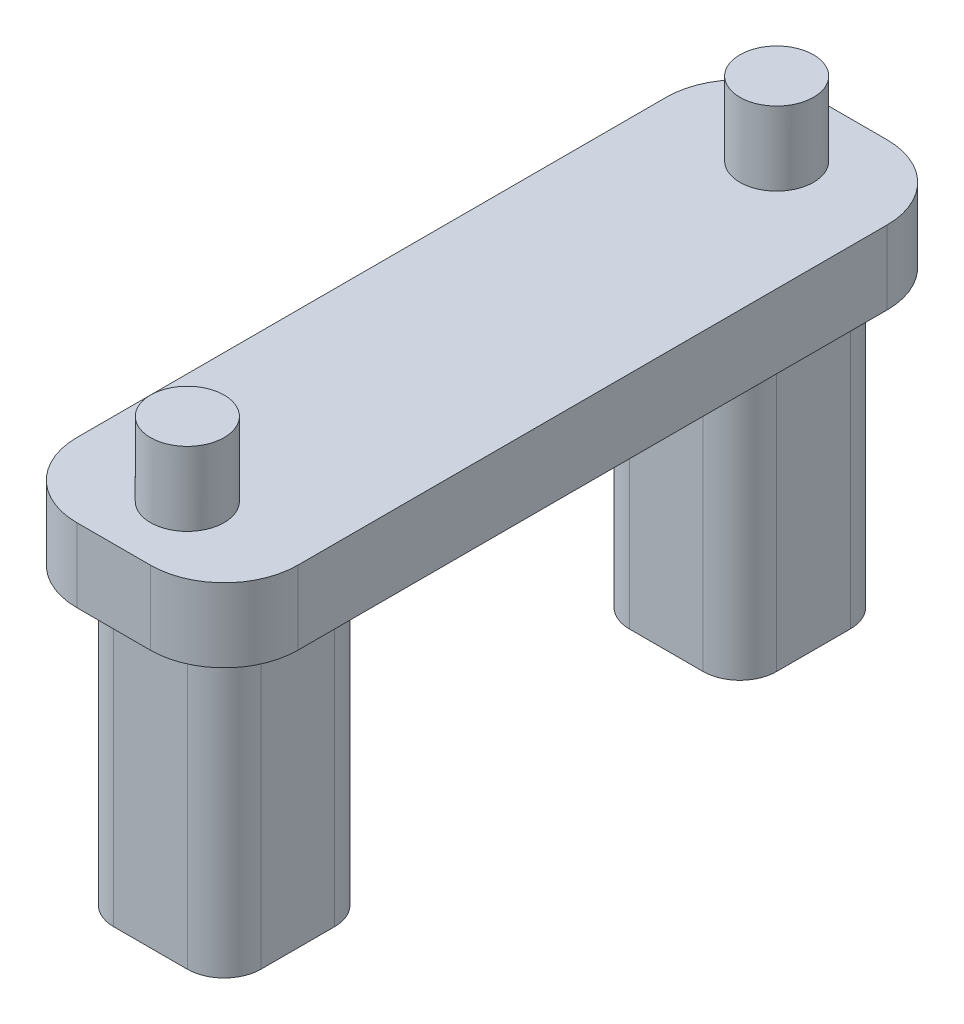
ISO-10303-21;
HEADER;
FILE_DESCRIPTION(('STEP AP214'),'2;1');
FILE_NAME('part.step','',(''),(''),'','','');
FILE_SCHEMA(('AUTOMOTIVE_DESIGN { 1 0 10303 214 1 1 1 1 }'));
ENDSEC;
DATA;
#1=APPLICATION_CONTEXT('core data for automotive mechanical design processes');
#2=APPLICATION_PROTOCOL_DEFINITION('international standard','automotive_design',2000,#1);
#3=PRODUCT_CONTEXT('',#1,'mechanical');
#4=PRODUCT('Part','Part','',(#3));
#5=PRODUCT_RELATED_PRODUCT_CATEGORY('part','',(#4));
#6=PRODUCT_DEFINITION_FORMATION('','',#4);
#7=PRODUCT_DEFINITION_CONTEXT('part definition',#1,'design');
#8=PRODUCT_DEFINITION('design','',#6,#7);
#9=PRODUCT_DEFINITION_SHAPE('','',#8);
#10=(LENGTH_UNIT() NAMED_UNIT(*) SI_UNIT(.MILLI.,.METRE.));
#11=(NAMED_UNIT(*) PLANE_ANGLE_UNIT() SI_UNIT($,.RADIAN.));
#12=(NAMED_UNIT(*) SI_UNIT($,.STERADIAN.) SOLID_ANGLE_UNIT());
#13=UNCERTAINTY_MEASURE_WITH_UNIT(LENGTH_MEASURE(1.E-05),#10,'distance_accuracy_value','');
#14=(GEOMETRIC_REPRESENTATION_CONTEXT(3) GLOBAL_UNCERTAINTY_ASSIGNED_CONTEXT((#13)) GLOBAL_UNIT_ASSIGNED_CONTEXT((#10,
#11,#12)) REPRESENTATION_CONTEXT('',''));
#15=CARTESIAN_POINT('',(0.,0.,0.));
#16=DIRECTION('',(0.,0.,1.));
#17=DIRECTION('',(1.,0.,0.));
#18=AXIS2_PLACEMENT_3D('',#15,#16,#17);
#19=CARTESIAN_POINT('',(0.,0.,0.));
#20=DIRECTION('',(0.,-1.,0.));
#21=DIRECTION('',(0.,0.,-1.));
#22=AXIS2_PLACEMENT_3D('',#19,#20,#21);
#23=PLANE('',#22);
#24=DIRECTION('',(0.,0.,1.));
#25=VECTOR('',#24,1.);
#26=CARTESIAN_POINT('',(-15.,0.,50.));
#27=LINE('',#26,#25);
#28=CARTESIAN_POINT('',(-15.,0.,-40.));
#29=VERTEX_POINT('',#28);
#30=CARTESIAN_POINT('',(-15.,0.,40.));
#31=VERTEX_POINT('',#30);
#32=EDGE_CURVE('E311',#29,#31,#27,.T.);
#33=ORIENTED_EDGE('',*,*,#32,.F.);
#34=CARTESIAN_POINT('',(-5.,0.,-40.));
#35=DIRECTION('',(0.,-1.,0.));
#36=DIRECTION('',(0.,0.,-1.));
#37=AXIS2_PLACEMENT_3D('',#34,#35,#36);
#38=CIRCLE('',#37,10.);
#39=CARTESIAN_POINT('',(-5.,0.,-50.));
#40=VERTEX_POINT('',#39);
#41=EDGE_CURVE('E332',#29,#40,#38,.T.);
#42=ORIENTED_EDGE('',*,*,#41,.T.);
#43=DIRECTION('',(-1.,0.,0.));
#44=VECTOR('',#43,1.);
#45=CARTESIAN_POINT('',(-15.,0.,-50.));
#46=LINE('',#45,#44);
#47=CARTESIAN_POINT('',(5.,0.,-50.));
#48=VERTEX_POINT('',#47);
#49=EDGE_CURVE('E308',#48,#40,#46,.T.);
#50=ORIENTED_EDGE('',*,*,#49,.F.);
#51=CARTESIAN_POINT('',(5.,0.,-40.));
#52=DIRECTION('',(0.,-1.,0.));
#53=DIRECTION('',(0.,0.,-1.));
#54=AXIS2_PLACEMENT_3D('',#51,#52,#53);
#55=CIRCLE('',#54,10.);
#56=CARTESIAN_POINT('',(15.,0.,-40.));
#57=VERTEX_POINT('',#56);
#58=EDGE_CURVE('E330',#48,#57,#55,.T.);
#59=ORIENTED_EDGE('',*,*,#58,.T.);
#60=DIRECTION('',(0.,0.,-1.));
#61=VECTOR('',#60,1.);
#62=CARTESIAN_POINT('',(15.,0.,50.));
#63=LINE('',#62,#61);
#64=CARTESIAN_POINT('',(15.,0.,40.));
#65=VERTEX_POINT('',#64);
#66=EDGE_CURVE('E291',#65,#57,#63,.T.);
#67=ORIENTED_EDGE('',*,*,#66,.F.);
#68=CARTESIAN_POINT('',(5.,0.,40.));
#69=DIRECTION('',(0.,-1.,0.));
#70=DIRECTION('',(0.,0.,-1.));
#71=AXIS2_PLACEMENT_3D('',#68,#69,#70);
#72=CIRCLE('',#71,10.);
#73=CARTESIAN_POINT('',(5.,0.,50.));
#74=VERTEX_POINT('',#73);
#75=EDGE_CURVE('E326',#65,#74,#72,.T.);
#76=ORIENTED_EDGE('',*,*,#75,.T.);
#77=DIRECTION('',(1.,0.,0.));
#78=VECTOR('',#77,1.);
#79=CARTESIAN_POINT('',(-15.,0.,50.));
#80=LINE('',#79,#78);
#81=CARTESIAN_POINT('',(-5.,0.,50.));
#82=VERTEX_POINT('',#81);
#83=EDGE_CURVE('E296',#82,#74,#80,.T.);
#84=ORIENTED_EDGE('',*,*,#83,.F.);
#85=CARTESIAN_POINT('',(-5.,0.,40.));
#86=DIRECTION('',(0.,-1.,0.));
#87=DIRECTION('',(0.,0.,-1.));
#88=AXIS2_PLACEMENT_3D('',#85,#86,#87);
#89=CIRCLE('',#88,10.);
#90=EDGE_CURVE('E328',#82,#31,#89,.T.);
#91=ORIENTED_EDGE('',*,*,#90,.T.);
#92=EDGE_LOOP('',(#33,#42,#50,#59,#67,#76,#84,#91));
#93=FACE_BOUND('',#92,.T.);
#94=DIRECTION('',(0.,0.,-1.));
#95=VECTOR('',#94,1.);
#96=CARTESIAN_POINT('',(-10.,0.,30.0000000000001));
#97=LINE('',#96,#95);
#98=CARTESIAN_POINT('',(-10.,0.,40.));
#99=VERTEX_POINT('',#98);
#100=CARTESIAN_POINT('',(-10.,0.,30.0000000000001));
#101=VERTEX_POINT('',#100);
#102=EDGE_CURVE('E228',#99,#101,#97,.T.);
#103=ORIENTED_EDGE('',*,*,#102,.F.);
#104=CARTESIAN_POINT('',(-5.,0.,40.));
#105=DIRECTION('',(0.,-1.,0.));
#106=DIRECTION('',(0.,0.,-1.));
#107=AXIS2_PLACEMENT_3D('',#104,#105,#106);
#108=CIRCLE('',#107,5.);
#109=CARTESIAN_POINT('',(-5.,0.,45.));
#110=VERTEX_POINT('',#109);
#111=EDGE_CURVE('E225',#110,#99,#108,.T.);
#112=ORIENTED_EDGE('',*,*,#111,.F.);
#113=DIRECTION('',(-1.,0.,0.));
#114=VECTOR('',#113,1.);
#115=CARTESIAN_POINT('',(-5.,0.,45.));
#116=LINE('',#115,#114);
#117=CARTESIAN_POINT('',(5.,0.,45.));
#118=VERTEX_POINT('',#117);
#119=EDGE_CURVE('E238',#118,#110,#116,.T.);
#120=ORIENTED_EDGE('',*,*,#119,.F.);
#121=CARTESIAN_POINT('',(5.,0.,40.));
#122=DIRECTION('',(0.,-1.,0.));
#123=DIRECTION('',(0.,0.,-1.));
#124=AXIS2_PLACEMENT_3D('',#121,#122,#123);
#125=CIRCLE('',#124,5.);
#126=CARTESIAN_POINT('',(10.,0.,40.));
#127=VERTEX_POINT('',#126);
#128=EDGE_CURVE('E262',#127,#118,#125,.T.);
#129=ORIENTED_EDGE('',*,*,#128,.F.);
#130=DIRECTION('',(0.,0.,1.));
#131=VECTOR('',#130,1.);
#132=CARTESIAN_POINT('',(10.,0.,40.));
#133=LINE('',#132,#131);
#134=CARTESIAN_POINT('',(10.,0.,30.));
#135=VERTEX_POINT('',#134);
#136=EDGE_CURVE('E260',#135,#127,#133,.T.);
#137=ORIENTED_EDGE('',*,*,#136,.F.);
#138=CARTESIAN_POINT('',(5.,0.,30.));
#139=DIRECTION('',(0.,-1.,0.));
#140=DIRECTION('',(0.,0.,1.));
#141=AXIS2_PLACEMENT_3D('',#138,#139,#140);
#142=CIRCLE('',#141,5.);
#143=CARTESIAN_POINT('',(4.99999999999993,0.,25.));
#144=VERTEX_POINT('',#143);
#145=EDGE_CURVE('E258',#144,#135,#142,.T.);
#146=ORIENTED_EDGE('',*,*,#145,.F.);
#147=DIRECTION('',(1.,0.,0.));
#148=VECTOR('',#147,1.);
#149=CARTESIAN_POINT('',(-4.99999999999996,0.,25.));
#150=LINE('',#149,#148);
#151=CARTESIAN_POINT('',(-4.99999999999996,0.,25.));
#152=VERTEX_POINT('',#151);
#153=EDGE_CURVE('E256',#152,#144,#150,.T.);
#154=ORIENTED_EDGE('',*,*,#153,.F.);
#155=CARTESIAN_POINT('',(-5.,0.,30.));
#156=DIRECTION('',(0.,-1.,0.));
#157=DIRECTION('',(0.,0.,-1.));
#158=AXIS2_PLACEMENT_3D('',#155,#156,#157);
#159=CIRCLE('',#158,5.);
#160=EDGE_CURVE('E254',#101,#152,#159,.T.);
#161=ORIENTED_EDGE('',*,*,#160,.F.);
#162=EDGE_LOOP('',(#103,#112,#120,#129,#137,#146,#154,#161));
#163=FACE_BOUND('',#162,.T.);
#164=DIRECTION('',(0.,0.,1.));
#165=VECTOR('',#164,1.);
#166=CARTESIAN_POINT('',(10.,0.,-30.0000000000001));
#167=LINE('',#166,#165);
#168=CARTESIAN_POINT('',(10.,0.,-40.));
#169=VERTEX_POINT('',#168);
#170=CARTESIAN_POINT('',(10.,0.,-30.0000000000001));
#171=VERTEX_POINT('',#170);
#172=EDGE_CURVE('E694',#169,#171,#167,.T.);
#173=ORIENTED_EDGE('',*,*,#172,.F.);
#174=CARTESIAN_POINT('',(5.,0.,-40.));
#175=DIRECTION('',(0.,-1.,0.));
#176=DIRECTION('',(0.,0.,-1.));
#177=AXIS2_PLACEMENT_3D('',#174,#175,#176);
#178=CIRCLE('',#177,5.);
#179=CARTESIAN_POINT('',(5.,0.,-45.));
#180=VERTEX_POINT('',#179);
#181=EDGE_CURVE('E223',#180,#169,#178,.T.);
#182=ORIENTED_EDGE('',*,*,#181,.F.);
#183=DIRECTION('',(1.,0.,0.));
#184=VECTOR('',#183,1.);
#185=CARTESIAN_POINT('',(5.,0.,-45.));
#186=LINE('',#185,#184);
#187=CARTESIAN_POINT('',(-5.,0.,-45.));
#188=VERTEX_POINT('',#187);
#189=EDGE_CURVE('E219',#188,#180,#186,.T.);
#190=ORIENTED_EDGE('',*,*,#189,.F.);
#191=CARTESIAN_POINT('',(-5.,0.,-40.));
#192=DIRECTION('',(0.,-1.,0.));
#193=DIRECTION('',(0.,0.,-1.));
#194=AXIS2_PLACEMENT_3D('',#191,#192,#193);
#195=CIRCLE('',#194,5.00000000000001);
#196=CARTESIAN_POINT('',(-10.,0.,-40.));
#197=VERTEX_POINT('',#196);
#198=EDGE_CURVE('E690',#197,#188,#195,.T.);
#199=ORIENTED_EDGE('',*,*,#198,.F.);
#200=DIRECTION('',(0.,0.,-1.));
#201=VECTOR('',#200,1.);
#202=CARTESIAN_POINT('',(-10.,0.,-40.));
#203=LINE('',#202,#201);
#204=CARTESIAN_POINT('',(-10.,0.,-30.0000000000001));
#205=VERTEX_POINT('',#204);
#206=EDGE_CURVE('E706',#205,#197,#203,.T.);
#207=ORIENTED_EDGE('',*,*,#206,.F.);
#208=CARTESIAN_POINT('',(-5.,0.,-30.));
#209=DIRECTION('',(0.,-1.,0.));
#210=DIRECTION('',(0.,0.,-1.));
#211=AXIS2_PLACEMENT_3D('',#208,#209,#210);
#212=CIRCLE('',#211,5.);
#213=CARTESIAN_POINT('',(-4.99999999999996,0.,-25.));
#214=VERTEX_POINT('',#213);
#215=EDGE_CURVE('E704',#214,#205,#212,.T.);
#216=ORIENTED_EDGE('',*,*,#215,.F.);
#217=DIRECTION('',(-1.,0.,0.));
#218=VECTOR('',#217,1.);
#219=CARTESIAN_POINT('',(-4.99999999999996,0.,-25.));
#220=LINE('',#219,#218);
#221=CARTESIAN_POINT('',(4.99999999999993,0.,-25.));
#222=VERTEX_POINT('',#221);
#223=EDGE_CURVE('E702',#222,#214,#220,.T.);
#224=ORIENTED_EDGE('',*,*,#223,.F.);
#225=CARTESIAN_POINT('',(5.,0.,-30.));
#226=DIRECTION('',(0.,-1.,0.));
#227=DIRECTION('',(0.,0.,-1.));
#228=AXIS2_PLACEMENT_3D('',#225,#226,#227);
#229=CIRCLE('',#228,5.);
#230=EDGE_CURVE('E696',#171,#222,#229,.T.);
#231=ORIENTED_EDGE('',*,*,#230,.F.);
#232=EDGE_LOOP('',(#173,#182,#190,#199,#207,#216,#224,#231));
#233=FACE_BOUND('',#232,.T.);
#234=ADVANCED_FACE('F38',(#93,#163,#233),#23,.T.);
#235=CARTESIAN_POINT('',(15.,10.,50.));
#236=DIRECTION('',(-1.,0.,0.));
#237=DIRECTION('',(0.,0.,1.));
#238=AXIS2_PLACEMENT_3D('',#235,#236,#237);
#239=PLANE('',#238);
#240=ORIENTED_EDGE('',*,*,#66,.T.);
#241=DIRECTION('',(0.,-1.,0.));
#242=VECTOR('',#241,1.);
#243=CARTESIAN_POINT('',(15.,10.,-40.));
#244=LINE('',#243,#242);
#245=CARTESIAN_POINT('',(15.,10.,-40.));
#246=VERTEX_POINT('',#245);
#247=EDGE_CURVE('E350',#57,#246,#244,.F.);
#248=ORIENTED_EDGE('',*,*,#247,.T.);
#249=DIRECTION('',(0.,0.,-1.));
#250=VECTOR('',#249,1.);
#251=CARTESIAN_POINT('',(15.,10.,50.));
#252=LINE('',#251,#250);
#253=CARTESIAN_POINT('',(15.,10.,40.));
#254=VERTEX_POINT('',#253);
#255=EDGE_CURVE('E292',#254,#246,#252,.T.);
#256=ORIENTED_EDGE('',*,*,#255,.F.);
#257=DIRECTION('',(0.,-1.,0.));
#258=VECTOR('',#257,1.);
#259=CARTESIAN_POINT('',(15.,10.,40.));
#260=LINE('',#259,#258);
#261=EDGE_CURVE('E347',#254,#65,#260,.T.);
#262=ORIENTED_EDGE('',*,*,#261,.T.);
#263=EDGE_LOOP('',(#240,#248,#256,#262));
#264=FACE_BOUND('',#263,.T.);
#265=ADVANCED_FACE('F366',(#264),#239,.F.);
#266=CARTESIAN_POINT('',(-15.,10.,-50.));
#267=DIRECTION('',(0.,0.,1.));
#268=DIRECTION('',(1.,0.,0.));
#269=AXIS2_PLACEMENT_3D('',#266,#267,#268);
#270=PLANE('',#269);
#271=ORIENTED_EDGE('',*,*,#49,.T.);
#272=DIRECTION('',(0.,-1.,0.));
#273=VECTOR('',#272,1.);
#274=CARTESIAN_POINT('',(-5.,10.,-50.));
#275=LINE('',#274,#273);
#276=CARTESIAN_POINT('',(-5.,10.,-50.));
#277=VERTEX_POINT('',#276);
#278=EDGE_CURVE('E337',#40,#277,#275,.F.);
#279=ORIENTED_EDGE('',*,*,#278,.T.);
#280=DIRECTION('',(-1.,0.,0.));
#281=VECTOR('',#280,1.);
#282=CARTESIAN_POINT('',(-15.,10.,-50.));
#283=LINE('',#282,#281);
#284=CARTESIAN_POINT('',(5.,10.,-50.));
#285=VERTEX_POINT('',#284);
#286=EDGE_CURVE('E295',#285,#277,#283,.T.);
#287=ORIENTED_EDGE('',*,*,#286,.F.);
#288=DIRECTION('',(0.,-1.,0.));
#289=VECTOR('',#288,1.);
#290=CARTESIAN_POINT('',(5.,10.,-50.));
#291=LINE('',#290,#289);
#292=EDGE_CURVE('E334',#285,#48,#291,.T.);
#293=ORIENTED_EDGE('',*,*,#292,.T.);
#294=EDGE_LOOP('',(#271,#279,#287,#293));
#295=FACE_BOUND('',#294,.T.);
#296=ADVANCED_FACE('F378',(#295),#270,.F.);
#297=CARTESIAN_POINT('',(-15.,10.,50.));
#298=DIRECTION('',(1.,0.,0.));
#299=DIRECTION('',(0.,0.,-1.));
#300=AXIS2_PLACEMENT_3D('',#297,#298,#299);
#301=PLANE('',#300);
#302=DIRECTION('',(0.,0.,1.));
#303=VECTOR('',#302,1.);
#304=CARTESIAN_POINT('',(-15.,10.,50.));
#305=LINE('',#304,#303);
#306=CARTESIAN_POINT('',(-15.,10.,-40.));
#307=VERTEX_POINT('',#306);
#308=CARTESIAN_POINT('',(-15.,10.,40.));
#309=VERTEX_POINT('',#308);
#310=EDGE_CURVE('E299',#307,#309,#305,.T.);
#311=ORIENTED_EDGE('',*,*,#310,.F.);
#312=DIRECTION('',(0.,-1.,0.));
#313=VECTOR('',#312,1.);
#314=CARTESIAN_POINT('',(-15.,10.,-40.));
#315=LINE('',#314,#313);
#316=EDGE_CURVE('E323',#307,#29,#315,.T.);
#317=ORIENTED_EDGE('',*,*,#316,.T.);
#318=ORIENTED_EDGE('',*,*,#32,.T.);
#319=DIRECTION('',(0.,-1.,0.));
#320=VECTOR('',#319,1.);
#321=CARTESIAN_POINT('',(-15.,10.,40.));
#322=LINE('',#321,#320);
#323=EDGE_CURVE('E321',#31,#309,#322,.F.);
#324=ORIENTED_EDGE('',*,*,#323,.T.);
#325=EDGE_LOOP('',(#311,#317,#318,#324));
#326=FACE_BOUND('',#325,.T.);
#327=ADVANCED_FACE('F386',(#326),#301,.F.);
#328=CARTESIAN_POINT('',(-15.,10.,50.));
#329=DIRECTION('',(0.,0.,-1.));
#330=DIRECTION('',(-1.,0.,0.));
#331=AXIS2_PLACEMENT_3D('',#328,#329,#330);
#332=PLANE('',#331);
#333=DIRECTION('',(1.,0.,0.));
#334=VECTOR('',#333,1.);
#335=CARTESIAN_POINT('',(-15.,10.,50.));
#336=LINE('',#335,#334);
#337=CARTESIAN_POINT('',(-5.,10.,50.));
#338=VERTEX_POINT('',#337);
#339=CARTESIAN_POINT('',(5.,10.,50.));
#340=VERTEX_POINT('',#339);
#341=EDGE_CURVE('E302',#338,#340,#336,.T.);
#342=ORIENTED_EDGE('',*,*,#341,.F.);
#343=DIRECTION('',(0.,-1.,0.));
#344=VECTOR('',#343,1.);
#345=CARTESIAN_POINT('',(-5.,10.,50.));
#346=LINE('',#345,#344);
#347=EDGE_CURVE('E11',#338,#82,#346,.T.);
#348=ORIENTED_EDGE('',*,*,#347,.T.);
#349=ORIENTED_EDGE('',*,*,#83,.T.);
#350=DIRECTION('',(0.,-1.,0.));
#351=VECTOR('',#350,1.);
#352=CARTESIAN_POINT('',(5.,10.,50.));
#353=LINE('',#352,#351);
#354=EDGE_CURVE('E46',#74,#340,#353,.F.);
#355=ORIENTED_EDGE('',*,*,#354,.T.);
#356=EDGE_LOOP('',(#342,#348,#349,#355));
#357=FACE_BOUND('',#356,.T.);
#358=ADVANCED_FACE('F354',(#357),#332,.F.);
#359=CARTESIAN_POINT('',(0.,10.,0.));
#360=DIRECTION('',(0.,-1.,0.));
#361=DIRECTION('',(0.,0.,-1.));
#362=AXIS2_PLACEMENT_3D('',#359,#360,#361);
#363=PLANE('',#362);
#364=CARTESIAN_POINT('',(0.,10.,40.));
#365=DIRECTION('',(0.,-1.,0.));
#366=DIRECTION('',(0.,0.,-1.));
#367=AXIS2_PLACEMENT_3D('',#364,#365,#366);
#368=CIRCLE('',#367,5.);
#369=CARTESIAN_POINT('',(0.,10.,35.));
#370=VERTEX_POINT('',#369);
#371=EDGE_CURVE('E318',#370,#370,#368,.F.);
#372=ORIENTED_EDGE('',*,*,#371,.F.);
#373=EDGE_LOOP('',(#372));
#374=FACE_BOUND('',#373,.T.);
#375=CARTESIAN_POINT('',(0.,10.,-40.));
#376=DIRECTION('',(0.,-1.,0.));
#377=DIRECTION('',(0.,0.,-1.));
#378=AXIS2_PLACEMENT_3D('',#375,#376,#377);
#379=CIRCLE('',#378,5.);
#380=CARTESIAN_POINT('',(0.,10.,-45.));
#381=VERTEX_POINT('',#380);
#382=EDGE_CURVE('E305',#381,#381,#379,.F.);
#383=ORIENTED_EDGE('',*,*,#382,.F.);
#384=EDGE_LOOP('',(#383));
#385=FACE_BOUND('',#384,.T.);
#386=ORIENTED_EDGE('',*,*,#286,.T.);
#387=CARTESIAN_POINT('',(-5.,10.,-40.));
#388=DIRECTION('',(0.,-1.,0.));
#389=DIRECTION('',(0.,0.,-1.));
#390=AXIS2_PLACEMENT_3D('',#387,#388,#389);
#391=CIRCLE('',#390,10.);
#392=EDGE_CURVE('E345',#277,#307,#391,.F.);
#393=ORIENTED_EDGE('',*,*,#392,.T.);
#394=ORIENTED_EDGE('',*,*,#310,.T.);
#395=CARTESIAN_POINT('',(-5.,10.,40.));
#396=DIRECTION('',(0.,-1.,0.));
#397=DIRECTION('',(0.,0.,-1.));
#398=AXIS2_PLACEMENT_3D('',#395,#396,#397);
#399=CIRCLE('',#398,10.);
#400=EDGE_CURVE('E341',#309,#338,#399,.F.);
#401=ORIENTED_EDGE('',*,*,#400,.T.);
#402=ORIENTED_EDGE('',*,*,#341,.T.);
#403=CARTESIAN_POINT('',(5.,10.,40.));
#404=DIRECTION('',(0.,-1.,0.));
#405=DIRECTION('',(0.,0.,-1.));
#406=AXIS2_PLACEMENT_3D('',#403,#404,#405);
#407=CIRCLE('',#406,10.);
#408=EDGE_CURVE('E339',#340,#254,#407,.F.);
#409=ORIENTED_EDGE('',*,*,#408,.T.);
#410=ORIENTED_EDGE('',*,*,#255,.T.);
#411=CARTESIAN_POINT('',(5.,10.,-40.));
#412=DIRECTION('',(0.,-1.,0.));
#413=DIRECTION('',(0.,0.,-1.));
#414=AXIS2_PLACEMENT_3D('',#411,#412,#413);
#415=CIRCLE('',#414,10.);
#416=EDGE_CURVE('E343',#246,#285,#415,.F.);
#417=ORIENTED_EDGE('',*,*,#416,.T.);
#418=EDGE_LOOP('',(#386,#393,#394,#401,#402,#409,#410,#417));
#419=FACE_BOUND('',#418,.T.);
#420=ADVANCED_FACE('F360',(#374,#385,#419),#363,.F.);
#421=CARTESIAN_POINT('',(0.,20.,-40.));
#422=DIRECTION('',(0.,-1.,0.));
#423=DIRECTION('',(0.,0.,-1.));
#424=AXIS2_PLACEMENT_3D('',#421,#422,#423);
#425=CYLINDRICAL_SURFACE('',#424,5.);
#426=CARTESIAN_POINT('',(0.,20.,-40.));
#427=DIRECTION('',(0.,1.,0.));
#428=DIRECTION('',(0.,0.,1.));
#429=AXIS2_PLACEMENT_3D('',#426,#427,#428);
#430=CIRCLE('',#429,5.);
#431=CARTESIAN_POINT('',(0.,20.,-35.));
#432=VERTEX_POINT('',#431);
#433=EDGE_CURVE('E288',#432,#432,#430,.T.);
#434=ORIENTED_EDGE('',*,*,#433,.F.);
#435=EDGE_LOOP('',(#434));
#436=FACE_BOUND('',#435,.T.);
#437=ORIENTED_EDGE('',*,*,#382,.T.);
#438=EDGE_LOOP('',(#437));
#439=FACE_BOUND('',#438,.T.);
#440=ADVANCED_FACE('F430',(#436,#439),#425,.T.);
#441=CARTESIAN_POINT('',(0.,20.,-40.));
#442=DIRECTION('',(0.,1.,0.));
#443=DIRECTION('',(0.,0.,1.));
#444=AXIS2_PLACEMENT_3D('',#441,#442,#443);
#445=PLANE('',#444);
#446=ORIENTED_EDGE('',*,*,#433,.T.);
#447=EDGE_LOOP('',(#446));
#448=FACE_BOUND('',#447,.T.);
#449=ADVANCED_FACE('F423',(#448),#445,.T.);
#450=CARTESIAN_POINT('',(0.,20.,40.));
#451=DIRECTION('',(0.,-1.,0.));
#452=DIRECTION('',(0.,0.,-1.));
#453=AXIS2_PLACEMENT_3D('',#450,#451,#452);
#454=CYLINDRICAL_SURFACE('',#453,5.);
#455=CARTESIAN_POINT('',(0.,20.,40.));
#456=DIRECTION('',(0.,1.,0.));
#457=DIRECTION('',(0.,0.,1.));
#458=AXIS2_PLACEMENT_3D('',#455,#456,#457);
#459=CIRCLE('',#458,5.);
#460=CARTESIAN_POINT('',(0.,20.,45.));
#461=VERTEX_POINT('',#460);
#462=EDGE_CURVE('E285',#461,#461,#459,.T.);
#463=ORIENTED_EDGE('',*,*,#462,.F.);
#464=EDGE_LOOP('',(#463));
#465=FACE_BOUND('',#464,.T.);
#466=ORIENTED_EDGE('',*,*,#371,.T.);
#467=EDGE_LOOP('',(#466));
#468=FACE_BOUND('',#467,.T.);
#469=ADVANCED_FACE('F417',(#465,#468),#454,.T.);
#470=CARTESIAN_POINT('',(0.,20.,40.));
#471=DIRECTION('',(0.,1.,0.));
#472=DIRECTION('',(0.,0.,1.));
#473=AXIS2_PLACEMENT_3D('',#470,#471,#472);
#474=PLANE('',#473);
#475=ORIENTED_EDGE('',*,*,#462,.T.);
#476=EDGE_LOOP('',(#475));
#477=FACE_BOUND('',#476,.T.);
#478=ADVANCED_FACE('F413',(#477),#474,.T.);
#479=CARTESIAN_POINT('',(-5.,10.,-40.));
#480=DIRECTION('',(0.,-1.,0.));
#481=DIRECTION('',(0.,0.,-1.));
#482=AXIS2_PLACEMENT_3D('',#479,#480,#481);
#483=CYLINDRICAL_SURFACE('',#482,10.);
#484=ORIENTED_EDGE('',*,*,#392,.F.);
#485=ORIENTED_EDGE('',*,*,#278,.F.);
#486=ORIENTED_EDGE('',*,*,#41,.F.);
#487=ORIENTED_EDGE('',*,*,#316,.F.);
#488=EDGE_LOOP('',(#484,#485,#486,#487));
#489=FACE_BOUND('',#488,.T.);
#490=ADVANCED_FACE('F384',(#489),#483,.T.);
#491=CARTESIAN_POINT('',(5.,10.,-40.));
#492=DIRECTION('',(0.,-1.,0.));
#493=DIRECTION('',(0.,0.,-1.));
#494=AXIS2_PLACEMENT_3D('',#491,#492,#493);
#495=CYLINDRICAL_SURFACE('',#494,10.);
#496=ORIENTED_EDGE('',*,*,#416,.F.);
#497=ORIENTED_EDGE('',*,*,#247,.F.);
#498=ORIENTED_EDGE('',*,*,#58,.F.);
#499=ORIENTED_EDGE('',*,*,#292,.F.);
#500=EDGE_LOOP('',(#496,#497,#498,#499));
#501=FACE_BOUND('',#500,.T.);
#502=ADVANCED_FACE('F375',(#501),#495,.T.);
#503=CARTESIAN_POINT('',(-5.,10.,40.));
#504=DIRECTION('',(0.,-1.,0.));
#505=DIRECTION('',(0.,0.,-1.));
#506=AXIS2_PLACEMENT_3D('',#503,#504,#505);
#507=CYLINDRICAL_SURFACE('',#506,10.);
#508=ORIENTED_EDGE('',*,*,#400,.F.);
#509=ORIENTED_EDGE('',*,*,#323,.F.);
#510=ORIENTED_EDGE('',*,*,#90,.F.);
#511=ORIENTED_EDGE('',*,*,#347,.F.);
#512=EDGE_LOOP('',(#508,#509,#510,#511));
#513=FACE_BOUND('',#512,.T.);
#514=ADVANCED_FACE('F389',(#513),#507,.T.);
#515=CARTESIAN_POINT('',(5.,10.,40.));
#516=DIRECTION('',(0.,-1.,0.));
#517=DIRECTION('',(0.,0.,-1.));
#518=AXIS2_PLACEMENT_3D('',#515,#516,#517);
#519=CYLINDRICAL_SURFACE('',#518,10.);
#520=ORIENTED_EDGE('',*,*,#408,.F.);
#521=ORIENTED_EDGE('',*,*,#354,.F.);
#522=ORIENTED_EDGE('',*,*,#75,.F.);
#523=ORIENTED_EDGE('',*,*,#261,.F.);
#524=EDGE_LOOP('',(#520,#521,#522,#523));
#525=FACE_BOUND('',#524,.T.);
#526=ADVANCED_FACE('F40',(#525),#519,.T.);
#527=CARTESIAN_POINT('',(-5.,-40.,40.));
#528=DIRECTION('',(0.,1.,0.));
#529=DIRECTION('',(0.,0.,1.));
#530=AXIS2_PLACEMENT_3D('',#527,#528,#529);
#531=CYLINDRICAL_SURFACE('',#530,5.);
#532=ORIENTED_EDGE('',*,*,#111,.T.);
#533=DIRECTION('',(0.,1.,0.));
#534=VECTOR('',#533,1.);
#535=CARTESIAN_POINT('',(-10.,-40.,40.));
#536=LINE('',#535,#534);
#537=CARTESIAN_POINT('',(-10.,-40.,40.));
#538=VERTEX_POINT('',#537);
#539=EDGE_CURVE('E283',#538,#99,#536,.T.);
#540=ORIENTED_EDGE('',*,*,#539,.F.);
#541=CARTESIAN_POINT('',(-5.,-40.,40.));
#542=DIRECTION('',(0.,-1.,0.));
#543=DIRECTION('',(0.,0.,-1.));
#544=AXIS2_PLACEMENT_3D('',#541,#542,#543);
#545=CIRCLE('',#544,5.);
#546=CARTESIAN_POINT('',(-5.,-40.,45.));
#547=VERTEX_POINT('',#546);
#548=EDGE_CURVE('E234',#547,#538,#545,.T.);
#549=ORIENTED_EDGE('',*,*,#548,.F.);
#550=DIRECTION('',(0.,1.,0.));
#551=VECTOR('',#550,1.);
#552=CARTESIAN_POINT('',(-5.,-40.,45.));
#553=LINE('',#552,#551);
#554=EDGE_CURVE('E251',#547,#110,#553,.T.);
#555=ORIENTED_EDGE('',*,*,#554,.T.);
#556=EDGE_LOOP('',(#532,#540,#549,#555));
#557=FACE_BOUND('',#556,.T.);
#558=ADVANCED_FACE('F395',(#557),#531,.T.);
#559=CARTESIAN_POINT('',(-10.,-40.,30.0000000000001));
#560=DIRECTION('',(1.,0.,0.));
#561=DIRECTION('',(0.,0.,-1.));
#562=AXIS2_PLACEMENT_3D('',#559,#560,#561);
#563=PLANE('',#562);
#564=ORIENTED_EDGE('',*,*,#102,.T.);
#565=DIRECTION('',(0.,1.,0.));
#566=VECTOR('',#565,1.);
#567=CARTESIAN_POINT('',(-10.,-40.,30.0000000000001));
#568=LINE('',#567,#566);
#569=CARTESIAN_POINT('',(-10.,-40.,30.0000000000001));
#570=VERTEX_POINT('',#569);
#571=EDGE_CURVE('E280',#570,#101,#568,.T.);
#572=ORIENTED_EDGE('',*,*,#571,.F.);
#573=DIRECTION('',(0.,0.,-1.));
#574=VECTOR('',#573,1.);
#575=CARTESIAN_POINT('',(-10.,-40.,30.0000000000001));
#576=LINE('',#575,#574);
#577=EDGE_CURVE('E237',#538,#570,#576,.T.);
#578=ORIENTED_EDGE('',*,*,#577,.F.);
#579=ORIENTED_EDGE('',*,*,#539,.T.);
#580=EDGE_LOOP('',(#564,#572,#578,#579));
#581=FACE_BOUND('',#580,.T.);
#582=ADVANCED_FACE('F522',(#581),#563,.F.);
#583=CARTESIAN_POINT('',(-5.,-40.,30.));
#584=DIRECTION('',(0.,1.,0.));
#585=DIRECTION('',(0.,0.,1.));
#586=AXIS2_PLACEMENT_3D('',#583,#584,#585);
#587=CYLINDRICAL_SURFACE('',#586,5.);
#588=ORIENTED_EDGE('',*,*,#160,.T.);
#589=DIRECTION('',(0.,1.,0.));
#590=VECTOR('',#589,1.);
#591=CARTESIAN_POINT('',(-4.99999999999996,-40.,25.));
#592=LINE('',#591,#590);
#593=CARTESIAN_POINT('',(-4.99999999999996,-40.,25.));
#594=VERTEX_POINT('',#593);
#595=EDGE_CURVE('E277',#594,#152,#592,.T.);
#596=ORIENTED_EDGE('',*,*,#595,.F.);
#597=CARTESIAN_POINT('',(-5.,-40.,30.));
#598=DIRECTION('',(0.,-1.,0.));
#599=DIRECTION('',(0.,0.,-1.));
#600=AXIS2_PLACEMENT_3D('',#597,#598,#599);
#601=CIRCLE('',#600,5.);
#602=EDGE_CURVE('E240',#570,#594,#601,.T.);
#603=ORIENTED_EDGE('',*,*,#602,.F.);
#604=ORIENTED_EDGE('',*,*,#571,.T.);
#605=EDGE_LOOP('',(#588,#596,#603,#604));
#606=FACE_BOUND('',#605,.T.);
#607=ADVANCED_FACE('F530',(#606),#587,.T.);
#608=CARTESIAN_POINT('',(-4.99999999999996,-40.,25.));
#609=DIRECTION('',(0.,0.,1.));
#610=DIRECTION('',(1.,0.,0.));
#611=AXIS2_PLACEMENT_3D('',#608,#609,#610);
#612=PLANE('',#611);
#613=ORIENTED_EDGE('',*,*,#153,.T.);
#614=DIRECTION('',(0.,1.,0.));
#615=VECTOR('',#614,1.);
#616=CARTESIAN_POINT('',(4.99999999999993,-40.,25.));
#617=LINE('',#616,#615);
#618=CARTESIAN_POINT('',(4.99999999999993,-40.,25.));
#619=VERTEX_POINT('',#618);
#620=EDGE_CURVE('E274',#619,#144,#617,.T.);
#621=ORIENTED_EDGE('',*,*,#620,.F.);
#622=DIRECTION('',(1.,0.,0.));
#623=VECTOR('',#622,1.);
#624=CARTESIAN_POINT('',(-4.99999999999996,-40.,25.));
#625=LINE('',#624,#623);
#626=EDGE_CURVE('E242',#594,#619,#625,.T.);
#627=ORIENTED_EDGE('',*,*,#626,.F.);
#628=ORIENTED_EDGE('',*,*,#595,.T.);
#629=EDGE_LOOP('',(#613,#621,#627,#628));
#630=FACE_BOUND('',#629,.T.);
#631=ADVANCED_FACE('F538',(#630),#612,.F.);
#632=CARTESIAN_POINT('',(5.,-40.,30.));
#633=DIRECTION('',(0.,1.,0.));
#634=DIRECTION('',(0.,0.,1.));
#635=AXIS2_PLACEMENT_3D('',#632,#633,#634);
#636=CYLINDRICAL_SURFACE('',#635,5.);
#637=ORIENTED_EDGE('',*,*,#145,.T.);
#638=DIRECTION('',(0.,1.,0.));
#639=VECTOR('',#638,1.);
#640=CARTESIAN_POINT('',(10.,-40.,30.));
#641=LINE('',#640,#639);
#642=CARTESIAN_POINT('',(10.,-40.,30.));
#643=VERTEX_POINT('',#642);
#644=EDGE_CURVE('E271',#643,#135,#641,.T.);
#645=ORIENTED_EDGE('',*,*,#644,.F.);
#646=CARTESIAN_POINT('',(5.,-40.,30.));
#647=DIRECTION('',(0.,-1.,0.));
#648=DIRECTION('',(0.,0.,1.));
#649=AXIS2_PLACEMENT_3D('',#646,#647,#648);
#650=CIRCLE('',#649,5.);
#651=EDGE_CURVE('E244',#619,#643,#650,.T.);
#652=ORIENTED_EDGE('',*,*,#651,.F.);
#653=ORIENTED_EDGE('',*,*,#620,.T.);
#654=EDGE_LOOP('',(#637,#645,#652,#653));
#655=FACE_BOUND('',#654,.T.);
#656=ADVANCED_FACE('F547',(#655),#636,.T.);
#657=CARTESIAN_POINT('',(10.,-40.,40.));
#658=DIRECTION('',(-1.,0.,0.));
#659=DIRECTION('',(0.,0.,1.));
#660=AXIS2_PLACEMENT_3D('',#657,#658,#659);
#661=PLANE('',#660);
#662=ORIENTED_EDGE('',*,*,#136,.T.);
#663=DIRECTION('',(0.,1.,0.));
#664=VECTOR('',#663,1.);
#665=CARTESIAN_POINT('',(10.,-40.,40.));
#666=LINE('',#665,#664);
#667=CARTESIAN_POINT('',(10.,-40.,40.));
#668=VERTEX_POINT('',#667);
#669=EDGE_CURVE('E268',#668,#127,#666,.T.);
#670=ORIENTED_EDGE('',*,*,#669,.F.);
#671=DIRECTION('',(0.,0.,1.));
#672=VECTOR('',#671,1.);
#673=CARTESIAN_POINT('',(10.,-40.,40.));
#674=LINE('',#673,#672);
#675=EDGE_CURVE('E246',#643,#668,#674,.T.);
#676=ORIENTED_EDGE('',*,*,#675,.F.);
#677=ORIENTED_EDGE('',*,*,#644,.T.);
#678=EDGE_LOOP('',(#662,#670,#676,#677));
#679=FACE_BOUND('',#678,.T.);
#680=ADVANCED_FACE('F556',(#679),#661,.F.);
#681=CARTESIAN_POINT('',(5.,-40.,40.));
#682=DIRECTION('',(0.,1.,0.));
#683=DIRECTION('',(0.,0.,1.));
#684=AXIS2_PLACEMENT_3D('',#681,#682,#683);
#685=CYLINDRICAL_SURFACE('',#684,5.);
#686=ORIENTED_EDGE('',*,*,#128,.T.);
#687=DIRECTION('',(0.,1.,0.));
#688=VECTOR('',#687,1.);
#689=CARTESIAN_POINT('',(5.,-40.,45.));
#690=LINE('',#689,#688);
#691=CARTESIAN_POINT('',(5.,-40.,45.));
#692=VERTEX_POINT('',#691);
#693=EDGE_CURVE('E61',#692,#118,#690,.T.);
#694=ORIENTED_EDGE('',*,*,#693,.F.);
#695=CARTESIAN_POINT('',(5.,-40.,40.));
#696=DIRECTION('',(0.,-1.,0.));
#697=DIRECTION('',(0.,0.,-1.));
#698=AXIS2_PLACEMENT_3D('',#695,#696,#697);
#699=CIRCLE('',#698,5.);
#700=EDGE_CURVE('E248',#668,#692,#699,.T.);
#701=ORIENTED_EDGE('',*,*,#700,.F.);
#702=ORIENTED_EDGE('',*,*,#669,.T.);
#703=EDGE_LOOP('',(#686,#694,#701,#702));
#704=FACE_BOUND('',#703,.T.);
#705=ADVANCED_FACE('F565',(#704),#685,.T.);
#706=CARTESIAN_POINT('',(-5.,-40.,45.));
#707=DIRECTION('',(0.,0.,-1.));
#708=DIRECTION('',(-1.,0.,0.));
#709=AXIS2_PLACEMENT_3D('',#706,#707,#708);
#710=PLANE('',#709);
#711=ORIENTED_EDGE('',*,*,#119,.T.);
#712=ORIENTED_EDGE('',*,*,#554,.F.);
#713=DIRECTION('',(-1.,0.,0.));
#714=VECTOR('',#713,1.);
#715=CARTESIAN_POINT('',(-5.,-40.,45.));
#716=LINE('',#715,#714);
#717=EDGE_CURVE('E250',#692,#547,#716,.T.);
#718=ORIENTED_EDGE('',*,*,#717,.F.);
#719=ORIENTED_EDGE('',*,*,#693,.T.);
#720=EDGE_LOOP('',(#711,#712,#718,#719));
#721=FACE_BOUND('',#720,.T.);
#722=ADVANCED_FACE('F574',(#721),#710,.F.);
#723=CARTESIAN_POINT('',(-5.,-40.,40.));
#724=DIRECTION('',(0.,-1.,0.));
#725=DIRECTION('',(0.,0.,-1.));
#726=AXIS2_PLACEMENT_3D('',#723,#724,#725);
#727=PLANE('',#726);
#728=ORIENTED_EDGE('',*,*,#548,.T.);
#729=ORIENTED_EDGE('',*,*,#577,.T.);
#730=ORIENTED_EDGE('',*,*,#602,.T.);
#731=ORIENTED_EDGE('',*,*,#626,.T.);
#732=ORIENTED_EDGE('',*,*,#651,.T.);
#733=ORIENTED_EDGE('',*,*,#675,.T.);
#734=ORIENTED_EDGE('',*,*,#700,.T.);
#735=ORIENTED_EDGE('',*,*,#717,.T.);
#736=EDGE_LOOP('',(#728,#729,#730,#731,#732,#733,#734,#735));
#737=FACE_BOUND('',#736,.T.);
#738=ADVANCED_FACE('F583',(#737),#727,.T.);
#739=CARTESIAN_POINT('',(5.,-40.,-40.));
#740=DIRECTION('',(0.,1.,0.));
#741=DIRECTION('',(0.,0.,1.));
#742=AXIS2_PLACEMENT_3D('',#739,#740,#741);
#743=CYLINDRICAL_SURFACE('',#742,5.);
#744=ORIENTED_EDGE('',*,*,#181,.T.);
#745=DIRECTION('',(0.,1.,0.));
#746=VECTOR('',#745,1.);
#747=CARTESIAN_POINT('',(10.,-40.,-40.));
#748=LINE('',#747,#746);
#749=CARTESIAN_POINT('',(10.,-40.,-40.));
#750=VERTEX_POINT('',#749);
#751=EDGE_CURVE('E204',#750,#169,#748,.T.);
#752=ORIENTED_EDGE('',*,*,#751,.F.);
#753=CARTESIAN_POINT('',(5.,-40.,-40.));
#754=DIRECTION('',(0.,-1.,0.));
#755=DIRECTION('',(0.,0.,-1.));
#756=AXIS2_PLACEMENT_3D('',#753,#754,#755);
#757=CIRCLE('',#756,5.);
#758=CARTESIAN_POINT('',(5.,-40.,-45.));
#759=VERTEX_POINT('',#758);
#760=EDGE_CURVE('E211',#759,#750,#757,.T.);
#761=ORIENTED_EDGE('',*,*,#760,.F.);
#762=DIRECTION('',(0.,1.,0.));
#763=VECTOR('',#762,1.);
#764=CARTESIAN_POINT('',(5.,-40.,-45.));
#765=LINE('',#764,#763);
#766=EDGE_CURVE('E687',#759,#180,#765,.T.);
#767=ORIENTED_EDGE('',*,*,#766,.T.);
#768=EDGE_LOOP('',(#744,#752,#761,#767));
#769=FACE_BOUND('',#768,.T.);
#770=ADVANCED_FACE('F221',(#769),#743,.T.);
#771=CARTESIAN_POINT('',(10.,-40.,-30.0000000000001));
#772=DIRECTION('',(-1.,0.,0.));
#773=DIRECTION('',(0.,0.,1.));
#774=AXIS2_PLACEMENT_3D('',#771,#772,#773);
#775=PLANE('',#774);
#776=ORIENTED_EDGE('',*,*,#172,.T.);
#777=DIRECTION('',(0.,1.,0.));
#778=VECTOR('',#777,1.);
#779=CARTESIAN_POINT('',(10.,-40.,-30.0000000000001));
#780=LINE('',#779,#778);
#781=CARTESIAN_POINT('',(10.,-40.,-30.0000000000001));
#782=VERTEX_POINT('',#781);
#783=EDGE_CURVE('E207',#782,#171,#780,.T.);
#784=ORIENTED_EDGE('',*,*,#783,.F.);
#785=DIRECTION('',(0.,0.,1.));
#786=VECTOR('',#785,1.);
#787=CARTESIAN_POINT('',(10.,-40.,-30.0000000000001));
#788=LINE('',#787,#786);
#789=EDGE_CURVE('E200',#750,#782,#788,.T.);
#790=ORIENTED_EDGE('',*,*,#789,.F.);
#791=ORIENTED_EDGE('',*,*,#751,.T.);
#792=EDGE_LOOP('',(#776,#784,#790,#791));
#793=FACE_BOUND('',#792,.T.);
#794=ADVANCED_FACE('F202',(#793),#775,.F.);
#795=CARTESIAN_POINT('',(5.,-40.,-30.));
#796=DIRECTION('',(0.,1.,0.));
#797=DIRECTION('',(0.,0.,1.));
#798=AXIS2_PLACEMENT_3D('',#795,#796,#797);
#799=CYLINDRICAL_SURFACE('',#798,5.);
#800=ORIENTED_EDGE('',*,*,#230,.T.);
#801=DIRECTION('',(0.,1.,0.));
#802=VECTOR('',#801,1.);
#803=CARTESIAN_POINT('',(4.99999999999993,-40.,-25.));
#804=LINE('',#803,#802);
#805=CARTESIAN_POINT('',(4.99999999999993,-40.,-25.));
#806=VERTEX_POINT('',#805);
#807=EDGE_CURVE('E230',#806,#222,#804,.T.);
#808=ORIENTED_EDGE('',*,*,#807,.F.);
#809=CARTESIAN_POINT('',(5.,-40.,-30.));
#810=DIRECTION('',(0.,-1.,0.));
#811=DIRECTION('',(0.,0.,-1.));
#812=AXIS2_PLACEMENT_3D('',#809,#810,#811);
#813=CIRCLE('',#812,5.);
#814=EDGE_CURVE('E210',#782,#806,#813,.T.);
#815=ORIENTED_EDGE('',*,*,#814,.F.);
#816=ORIENTED_EDGE('',*,*,#783,.T.);
#817=EDGE_LOOP('',(#800,#808,#815,#816));
#818=FACE_BOUND('',#817,.T.);
#819=ADVANCED_FACE('F606',(#818),#799,.T.);
#820=CARTESIAN_POINT('',(-4.99999999999996,-40.,-25.));
#821=DIRECTION('',(0.,0.,-1.));
#822=DIRECTION('',(-1.,0.,0.));
#823=AXIS2_PLACEMENT_3D('',#820,#821,#822);
#824=PLANE('',#823);
#825=ORIENTED_EDGE('',*,*,#223,.T.);
#826=DIRECTION('',(0.,1.,0.));
#827=VECTOR('',#826,1.);
#828=CARTESIAN_POINT('',(-4.99999999999996,-40.,-25.));
#829=LINE('',#828,#827);
#830=CARTESIAN_POINT('',(-4.99999999999996,-40.,-25.));
#831=VERTEX_POINT('',#830);
#832=EDGE_CURVE('E716',#831,#214,#829,.T.);
#833=ORIENTED_EDGE('',*,*,#832,.F.);
#834=DIRECTION('',(-1.,0.,0.));
#835=VECTOR('',#834,1.);
#836=CARTESIAN_POINT('',(-4.99999999999996,-40.,-25.));
#837=LINE('',#836,#835);
#838=EDGE_CURVE('E723',#806,#831,#837,.T.);
#839=ORIENTED_EDGE('',*,*,#838,.F.);
#840=ORIENTED_EDGE('',*,*,#807,.T.);
#841=EDGE_LOOP('',(#825,#833,#839,#840));
#842=FACE_BOUND('',#841,.T.);
#843=ADVANCED_FACE('F614',(#842),#824,.F.);
#844=CARTESIAN_POINT('',(-5.,-40.,-30.));
#845=DIRECTION('',(0.,1.,0.));
#846=DIRECTION('',(0.,0.,1.));
#847=AXIS2_PLACEMENT_3D('',#844,#845,#846);
#848=CYLINDRICAL_SURFACE('',#847,5.);
#849=ORIENTED_EDGE('',*,*,#215,.T.);
#850=DIRECTION('',(0.,1.,0.));
#851=VECTOR('',#850,1.);
#852=CARTESIAN_POINT('',(-10.,-40.,-30.0000000000001));
#853=LINE('',#852,#851);
#854=CARTESIAN_POINT('',(-10.,-40.,-30.0000000000001));
#855=VERTEX_POINT('',#854);
#856=EDGE_CURVE('E713',#855,#205,#853,.T.);
#857=ORIENTED_EDGE('',*,*,#856,.F.);
#858=CARTESIAN_POINT('',(-5.,-40.,-30.));
#859=DIRECTION('',(0.,-1.,0.));
#860=DIRECTION('',(0.,0.,-1.));
#861=AXIS2_PLACEMENT_3D('',#858,#859,#860);
#862=CIRCLE('',#861,5.);
#863=EDGE_CURVE('E733',#831,#855,#862,.T.);
#864=ORIENTED_EDGE('',*,*,#863,.F.);
#865=ORIENTED_EDGE('',*,*,#832,.T.);
#866=EDGE_LOOP('',(#849,#857,#864,#865));
#867=FACE_BOUND('',#866,.T.);
#868=ADVANCED_FACE('F623',(#867),#848,.T.);
#869=CARTESIAN_POINT('',(-10.,-40.,-40.));
#870=DIRECTION('',(1.,0.,0.));
#871=DIRECTION('',(0.,0.,-1.));
#872=AXIS2_PLACEMENT_3D('',#869,#870,#871);
#873=PLANE('',#872);
#874=ORIENTED_EDGE('',*,*,#206,.T.);
#875=DIRECTION('',(0.,1.,0.));
#876=VECTOR('',#875,1.);
#877=CARTESIAN_POINT('',(-10.,-40.,-40.));
#878=LINE('',#877,#876);
#879=CARTESIAN_POINT('',(-10.,-40.,-40.));
#880=VERTEX_POINT('',#879);
#881=EDGE_CURVE('E710',#880,#197,#878,.T.);
#882=ORIENTED_EDGE('',*,*,#881,.F.);
#883=DIRECTION('',(0.,0.,-1.));
#884=VECTOR('',#883,1.);
#885=CARTESIAN_POINT('',(-10.,-40.,-40.));
#886=LINE('',#885,#884);
#887=EDGE_CURVE('E730',#855,#880,#886,.T.);
#888=ORIENTED_EDGE('',*,*,#887,.F.);
#889=ORIENTED_EDGE('',*,*,#856,.T.);
#890=EDGE_LOOP('',(#874,#882,#888,#889));
#891=FACE_BOUND('',#890,.T.);
#892=ADVANCED_FACE('F632',(#891),#873,.F.);
#893=CARTESIAN_POINT('',(-5.,-40.,-40.));
#894=DIRECTION('',(0.,1.,0.));
#895=DIRECTION('',(0.,0.,1.));
#896=AXIS2_PLACEMENT_3D('',#893,#894,#895);
#897=CYLINDRICAL_SURFACE('',#896,5.00000000000001);
#898=ORIENTED_EDGE('',*,*,#198,.T.);
#899=DIRECTION('',(0.,1.,0.));
#900=VECTOR('',#899,1.);
#901=CARTESIAN_POINT('',(-5.,-40.,-45.));
#902=LINE('',#901,#900);
#903=CARTESIAN_POINT('',(-5.,-40.,-45.));
#904=VERTEX_POINT('',#903);
#905=EDGE_CURVE('E53',#904,#188,#902,.T.);
#906=ORIENTED_EDGE('',*,*,#905,.F.);
#907=CARTESIAN_POINT('',(-5.,-40.,-40.));
#908=DIRECTION('',(0.,-1.,0.));
#909=DIRECTION('',(0.,0.,-1.));
#910=AXIS2_PLACEMENT_3D('',#907,#908,#909);
#911=CIRCLE('',#910,5.00000000000001);
#912=EDGE_CURVE('E732',#880,#904,#911,.T.);
#913=ORIENTED_EDGE('',*,*,#912,.F.);
#914=ORIENTED_EDGE('',*,*,#881,.T.);
#915=EDGE_LOOP('',(#898,#906,#913,#914));
#916=FACE_BOUND('',#915,.T.);
#917=ADVANCED_FACE('F641',(#916),#897,.T.);
#918=CARTESIAN_POINT('',(5.,-40.,-45.));
#919=DIRECTION('',(0.,0.,1.));
#920=DIRECTION('',(1.,0.,0.));
#921=AXIS2_PLACEMENT_3D('',#918,#919,#920);
#922=PLANE('',#921);
#923=ORIENTED_EDGE('',*,*,#189,.T.);
#924=ORIENTED_EDGE('',*,*,#766,.F.);
#925=DIRECTION('',(1.,0.,0.));
#926=VECTOR('',#925,1.);
#927=CARTESIAN_POINT('',(5.,-40.,-45.));
#928=LINE('',#927,#926);
#929=EDGE_CURVE('E215',#904,#759,#928,.T.);
#930=ORIENTED_EDGE('',*,*,#929,.F.);
#931=ORIENTED_EDGE('',*,*,#905,.T.);
#932=EDGE_LOOP('',(#923,#924,#930,#931));
#933=FACE_BOUND('',#932,.T.);
#934=ADVANCED_FACE('F650',(#933),#922,.F.);
#935=CARTESIAN_POINT('',(5.,-40.,-40.));
#936=DIRECTION('',(0.,-1.,0.));
#937=DIRECTION('',(0.,0.,-1.));
#938=AXIS2_PLACEMENT_3D('',#935,#936,#937);
#939=PLANE('',#938);
#940=ORIENTED_EDGE('',*,*,#760,.T.);
#941=ORIENTED_EDGE('',*,*,#789,.T.);
#942=ORIENTED_EDGE('',*,*,#814,.T.);
#943=ORIENTED_EDGE('',*,*,#838,.T.);
#944=ORIENTED_EDGE('',*,*,#863,.T.);
#945=ORIENTED_EDGE('',*,*,#887,.T.);
#946=ORIENTED_EDGE('',*,*,#912,.T.);
#947=ORIENTED_EDGE('',*,*,#929,.T.);
#948=EDGE_LOOP('',(#940,#941,#942,#943,#944,#945,#946,#947));
#949=FACE_BOUND('',#948,.T.);
#950=ADVANCED_FACE('F214',(#949),#939,.T.);
#951=CLOSED_SHELL('',(#234,#265,#296,#327,#358,#420,#440,#449,#469,#478,#490,#502,#514,#526,
#558,#582,#607,#631,#656,#680,#705,#722,#738,#770,#794,#819,#843,#868,#892,#917,#934,#950));
#952=MANIFOLD_SOLID_BREP('B2',#951);
#953=ADVANCED_BREP_SHAPE_REPRESENTATION('',(#18,#952),#14);
#954=SHAPE_DEFINITION_REPRESENTATION(#9,#953);
ENDSEC;
END-ISO-10303-21;
